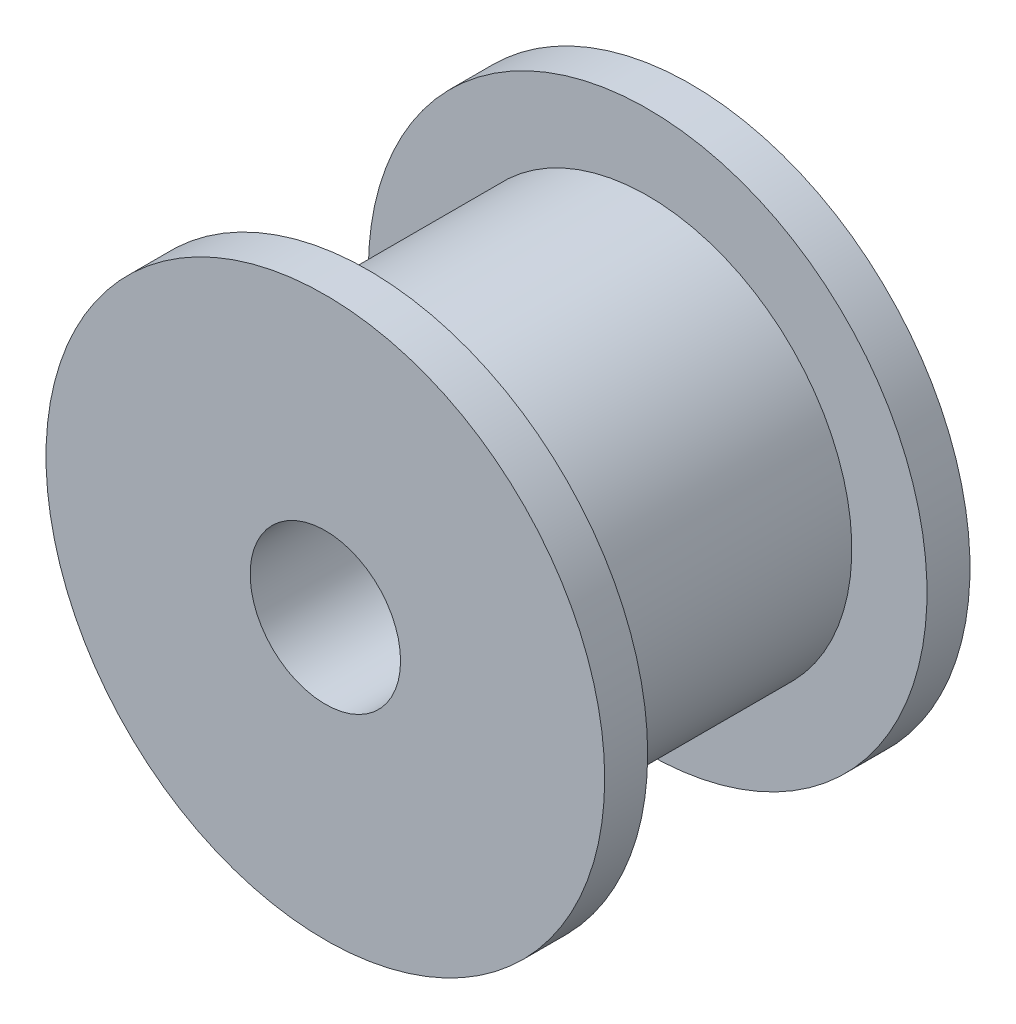
ISO-10303-21;
HEADER;
FILE_DESCRIPTION(('STEP AP214'),'2;1');
FILE_NAME('part.step','',(''),(''),'','','');
FILE_SCHEMA(('AUTOMOTIVE_DESIGN { 1 0 10303 214 1 1 1 1 }'));
ENDSEC;
DATA;
#1=APPLICATION_CONTEXT('core data for automotive mechanical design processes');
#2=APPLICATION_PROTOCOL_DEFINITION('international standard','automotive_design',2000,#1);
#3=PRODUCT_CONTEXT('',#1,'mechanical');
#4=PRODUCT('Part','Part','',(#3));
#5=PRODUCT_RELATED_PRODUCT_CATEGORY('part','',(#4));
#6=PRODUCT_DEFINITION_FORMATION('','',#4);
#7=PRODUCT_DEFINITION_CONTEXT('part definition',#1,'design');
#8=PRODUCT_DEFINITION('design','',#6,#7);
#9=PRODUCT_DEFINITION_SHAPE('','',#8);
#10=(LENGTH_UNIT() NAMED_UNIT(*) SI_UNIT(.MILLI.,.METRE.));
#11=(NAMED_UNIT(*) PLANE_ANGLE_UNIT() SI_UNIT($,.RADIAN.));
#12=(NAMED_UNIT(*) SI_UNIT($,.STERADIAN.) SOLID_ANGLE_UNIT());
#13=UNCERTAINTY_MEASURE_WITH_UNIT(LENGTH_MEASURE(1.E-05),#10,'distance_accuracy_value','');
#14=(GEOMETRIC_REPRESENTATION_CONTEXT(3) GLOBAL_UNCERTAINTY_ASSIGNED_CONTEXT((#13)) GLOBAL_UNIT_ASSIGNED_CONTEXT((#10,
#11,#12)) REPRESENTATION_CONTEXT('',''));
#15=CARTESIAN_POINT('',(0.,0.,0.));
#16=DIRECTION('',(0.,0.,1.));
#17=DIRECTION('',(1.,0.,0.));
#18=AXIS2_PLACEMENT_3D('',#15,#16,#17);
#19=CARTESIAN_POINT('',(0.,0.,6.5));
#20=DIRECTION('',(0.,0.,-1.));
#21=DIRECTION('',(-1.,0.,0.));
#22=AXIS2_PLACEMENT_3D('',#19,#20,#21);
#23=CYLINDRICAL_SURFACE('',#22,4.75);
#24=CARTESIAN_POINT('',(0.,0.,6.5));
#25=DIRECTION('',(0.,0.,1.));
#26=DIRECTION('',(1.,0.,0.));
#27=AXIS2_PLACEMENT_3D('',#24,#25,#26);
#28=CIRCLE('',#27,4.75);
#29=CARTESIAN_POINT('',(-4.75,0.,6.5));
#30=VERTEX_POINT('',#29);
#31=EDGE_CURVE('E10',#30,#30,#28,.T.);
#32=CARTESIAN_POINT('',(0.,0.,0.));
#33=DIRECTION('',(0.,0.,1.));
#34=DIRECTION('',(1.,0.,0.));
#35=AXIS2_PLACEMENT_3D('',#32,#33,#34);
#36=CIRCLE('',#35,4.75);
#37=CARTESIAN_POINT('',(-4.75,0.,0.));
#38=VERTEX_POINT('',#37);
#39=EDGE_CURVE('E47',#38,#38,#36,.T.);
#40=CARTESIAN_POINT('',(-4.75,0.,6.5));
#41=CARTESIAN_POINT('',(-4.75,0.,6.43229166666667));
#42=CARTESIAN_POINT('',(-4.75,0.,6.36458333333333));
#43=CARTESIAN_POINT('',(-4.75,0.,6.22916666666667));
#44=CARTESIAN_POINT('',(-4.75,0.,6.16145833333333));
#45=CARTESIAN_POINT('',(-4.75,0.,6.02604166666667));
#46=CARTESIAN_POINT('',(-4.75,0.,5.95833333333333));
#47=CARTESIAN_POINT('',(-4.75,0.,5.82291666666667));
#48=CARTESIAN_POINT('',(-4.75,0.,5.75520833333333));
#49=CARTESIAN_POINT('',(-4.75,0.,5.61979166666667));
#50=CARTESIAN_POINT('',(-4.75,0.,5.55208333333333));
#51=CARTESIAN_POINT('',(-4.75,0.,5.41666666666667));
#52=CARTESIAN_POINT('',(-4.75,0.,5.34895833333333));
#53=CARTESIAN_POINT('',(-4.75,0.,5.21354166666667));
#54=CARTESIAN_POINT('',(-4.75,0.,5.14583333333333));
#55=CARTESIAN_POINT('',(-4.75,0.,5.01041666666667));
#56=CARTESIAN_POINT('',(-4.75,0.,4.94270833333333));
#57=CARTESIAN_POINT('',(-4.75,0.,4.80729166666667));
#58=CARTESIAN_POINT('',(-4.75,0.,4.73958333333333));
#59=CARTESIAN_POINT('',(-4.75,0.,4.60416666666667));
#60=CARTESIAN_POINT('',(-4.75,0.,4.53645833333333));
#61=CARTESIAN_POINT('',(-4.75,0.,4.40104166666667));
#62=CARTESIAN_POINT('',(-4.75,0.,4.33333333333333));
#63=CARTESIAN_POINT('',(-4.75,0.,4.19791666666667));
#64=CARTESIAN_POINT('',(-4.75,0.,4.13020833333333));
#65=CARTESIAN_POINT('',(-4.75,0.,3.99479166666667));
#66=CARTESIAN_POINT('',(-4.75,0.,3.92708333333333));
#67=CARTESIAN_POINT('',(-4.75,0.,3.79166666666667));
#68=CARTESIAN_POINT('',(-4.75,0.,3.72395833333333));
#69=CARTESIAN_POINT('',(-4.75,0.,3.58854166666667));
#70=CARTESIAN_POINT('',(-4.75,0.,3.52083333333333));
#71=CARTESIAN_POINT('',(-4.75,0.,3.38541666666667));
#72=CARTESIAN_POINT('',(-4.75,0.,3.31770833333333));
#73=CARTESIAN_POINT('',(-4.75,0.,3.18229166666667));
#74=CARTESIAN_POINT('',(-4.75,0.,3.11458333333333));
#75=CARTESIAN_POINT('',(-4.75,0.,2.97916666666667));
#76=CARTESIAN_POINT('',(-4.75,0.,2.91145833333333));
#77=CARTESIAN_POINT('',(-4.75,0.,2.77604166666667));
#78=CARTESIAN_POINT('',(-4.75,0.,2.70833333333333));
#79=CARTESIAN_POINT('',(-4.75,0.,2.57291666666667));
#80=CARTESIAN_POINT('',(-4.75,0.,2.50520833333333));
#81=CARTESIAN_POINT('',(-4.75,0.,2.36979166666667));
#82=CARTESIAN_POINT('',(-4.75,0.,2.30208333333333));
#83=CARTESIAN_POINT('',(-4.75,0.,2.16666666666667));
#84=CARTESIAN_POINT('',(-4.75,0.,2.09895833333333));
#85=CARTESIAN_POINT('',(-4.75,0.,1.96354166666667));
#86=CARTESIAN_POINT('',(-4.75,0.,1.89583333333333));
#87=CARTESIAN_POINT('',(-4.75,0.,1.76041666666667));
#88=CARTESIAN_POINT('',(-4.75,0.,1.69270833333333));
#89=CARTESIAN_POINT('',(-4.75,0.,1.55729166666667));
#90=CARTESIAN_POINT('',(-4.75,0.,1.48958333333333));
#91=CARTESIAN_POINT('',(-4.75,0.,1.35416666666667));
#92=CARTESIAN_POINT('',(-4.75,0.,1.28645833333333));
#93=CARTESIAN_POINT('',(-4.75,0.,1.15104166666667));
#94=CARTESIAN_POINT('',(-4.75,0.,1.08333333333333));
#95=CARTESIAN_POINT('',(-4.75,0.,0.947916666666667));
#96=CARTESIAN_POINT('',(-4.75,0.,0.880208333333333));
#97=CARTESIAN_POINT('',(-4.75,0.,0.744791666666667));
#98=CARTESIAN_POINT('',(-4.75,0.,0.677083333333333));
#99=CARTESIAN_POINT('',(-4.75,0.,0.541666666666667));
#100=CARTESIAN_POINT('',(-4.75,0.,0.473958333333333));
#101=CARTESIAN_POINT('',(-4.75,0.,0.338541666666667));
#102=CARTESIAN_POINT('',(-4.75,0.,0.270833333333334));
#103=CARTESIAN_POINT('',(-4.75,0.,0.135416666666667));
#104=CARTESIAN_POINT('',(-4.75,0.,0.0677083333333334));
#105=CARTESIAN_POINT('',(-4.75,0.,0.));
#106=B_SPLINE_CURVE_WITH_KNOTS('',3,(#40,#41,#42,#43,#44,#45,#46,#47,#48,#49,#50,#51,#52,#53,
#54,#55,#56,#57,#58,#59,#60,#61,#62,#63,#64,#65,#66,#67,#68,#69,#70,#71,#72,#73,#74,#75,#76,#77,
#78,#79,#80,#81,#82,#83,#84,#85,#86,#87,#88,#89,#90,#91,#92,#93,#94,#95,#96,#97,#98,#99,#100,
#101,#102,#103,#104,#105),.UNSPECIFIED.,.F.,.F.,(4,2,2,2,2,2,2,2,2,2,2,2,2,2,2,2,2,2,2,2,2,2,2,
2,2,2,2,2,2,2,2,2,4),(0.,0.203125,0.40625,0.609375000000001,0.812500000000001,1.015625,1.21875,
1.421875,1.625,1.828125,2.03125,2.234375,2.4375,2.640625,2.84375,3.046875,3.25,3.453125,3.65625,
3.859375,4.0625,4.265625,4.46875,4.671875,4.875,5.078125,5.28125,5.484375,5.6875,5.890625,
6.09375,6.296875,6.5),.UNSPECIFIED.);
#107=EDGE_CURVE('BSEAM32',#30,#38,#106,.T.);
#108=ORIENTED_EDGE('',*,*,#31,.F.);
#109=ORIENTED_EDGE('',*,*,#39,.T.);
#110=ORIENTED_EDGE('',*,*,#107,.T.);
#111=ORIENTED_EDGE('',*,*,#107,.F.);
#112=EDGE_LOOP('',(#108,#110,#109,#111));
#113=FACE_BOUND('',#112,.T.);
#114=ADVANCED_FACE('F32',(#113),#23,.T.);
#115=CARTESIAN_POINT('',(0.,0.,7.5));
#116=DIRECTION('',(0.,0.,-1.));
#117=DIRECTION('',(-1.,0.,0.));
#118=AXIS2_PLACEMENT_3D('',#115,#116,#117);
#119=CYLINDRICAL_SURFACE('',#118,6.5);
#120=CARTESIAN_POINT('',(0.,0.,7.5));
#121=DIRECTION('',(0.,0.,1.));
#122=DIRECTION('',(1.,0.,0.));
#123=AXIS2_PLACEMENT_3D('',#120,#121,#122);
#124=CIRCLE('',#123,6.5);
#125=CARTESIAN_POINT('',(6.5,0.,7.5));
#126=VERTEX_POINT('',#125);
#127=EDGE_CURVE('E39',#126,#126,#124,.T.);
#128=ORIENTED_EDGE('',*,*,#127,.F.);
#129=EDGE_LOOP('',(#128));
#130=FACE_BOUND('',#129,.T.);
#131=CARTESIAN_POINT('',(0.,0.,6.5));
#132=DIRECTION('',(0.,0.,1.));
#133=DIRECTION('',(1.,0.,0.));
#134=AXIS2_PLACEMENT_3D('',#131,#132,#133);
#135=CIRCLE('',#134,6.5);
#136=CARTESIAN_POINT('',(6.5,0.,6.5));
#137=VERTEX_POINT('',#136);
#138=EDGE_CURVE('E44',#137,#137,#135,.T.);
#139=ORIENTED_EDGE('',*,*,#138,.T.);
#140=EDGE_LOOP('',(#139));
#141=FACE_BOUND('',#140,.T.);
#142=ADVANCED_FACE('F86',(#130,#141),#119,.T.);
#143=CARTESIAN_POINT('',(0.,0.,7.5));
#144=DIRECTION('',(0.,0.,1.));
#145=DIRECTION('',(1.,0.,0.));
#146=AXIS2_PLACEMENT_3D('',#143,#144,#145);
#147=PLANE('',#146);
#148=CARTESIAN_POINT('',(0.,0.,7.5));
#149=DIRECTION('',(0.,0.,1.));
#150=DIRECTION('',(1.,0.,0.));
#151=AXIS2_PLACEMENT_3D('',#148,#149,#150);
#152=CIRCLE('',#151,1.75);
#153=CARTESIAN_POINT('',(1.75,0.,7.5));
#154=VERTEX_POINT('',#153);
#155=EDGE_CURVE('E61',#154,#154,#152,.T.);
#156=ORIENTED_EDGE('',*,*,#155,.F.);
#157=EDGE_LOOP('',(#156));
#158=FACE_BOUND('',#157,.T.);
#159=ORIENTED_EDGE('',*,*,#127,.T.);
#160=EDGE_LOOP('',(#159));
#161=FACE_BOUND('',#160,.T.);
#162=ADVANCED_FACE('F91',(#158,#161),#147,.T.);
#163=CARTESIAN_POINT('',(0.,0.,6.5));
#164=DIRECTION('',(0.,0.,1.));
#165=DIRECTION('',(1.,0.,0.));
#166=AXIS2_PLACEMENT_3D('',#163,#164,#165);
#167=PLANE('',#166);
#168=ORIENTED_EDGE('',*,*,#31,.T.);
#169=EDGE_LOOP('',(#168));
#170=FACE_BOUND('',#169,.T.);
#171=ORIENTED_EDGE('',*,*,#138,.F.);
#172=EDGE_LOOP('',(#171));
#173=FACE_BOUND('',#172,.T.);
#174=ADVANCED_FACE('F81',(#170,#173),#167,.F.);
#175=CARTESIAN_POINT('',(0.,0.,-1.));
#176=DIRECTION('',(0.,0.,1.));
#177=DIRECTION('',(1.,0.,0.));
#178=AXIS2_PLACEMENT_3D('',#175,#176,#177);
#179=CYLINDRICAL_SURFACE('',#178,6.5);
#180=CARTESIAN_POINT('',(0.,0.,-1.));
#181=DIRECTION('',(0.,0.,-1.));
#182=DIRECTION('',(-1.,0.,0.));
#183=AXIS2_PLACEMENT_3D('',#180,#181,#182);
#184=CIRCLE('',#183,6.5);
#185=CARTESIAN_POINT('',(-6.5,0.,-1.));
#186=VERTEX_POINT('',#185);
#187=EDGE_CURVE('E49',#186,#186,#184,.T.);
#188=ORIENTED_EDGE('',*,*,#187,.F.);
#189=EDGE_LOOP('',(#188));
#190=FACE_BOUND('',#189,.T.);
#191=CARTESIAN_POINT('',(0.,0.,0.));
#192=DIRECTION('',(0.,0.,-1.));
#193=DIRECTION('',(-1.,0.,0.));
#194=AXIS2_PLACEMENT_3D('',#191,#192,#193);
#195=CIRCLE('',#194,6.5);
#196=CARTESIAN_POINT('',(-6.5,0.,0.));
#197=VERTEX_POINT('',#196);
#198=EDGE_CURVE('E54',#197,#197,#195,.T.);
#199=ORIENTED_EDGE('',*,*,#198,.T.);
#200=EDGE_LOOP('',(#199));
#201=FACE_BOUND('',#200,.T.);
#202=ADVANCED_FACE('F73',(#190,#201),#179,.T.);
#203=CARTESIAN_POINT('',(0.,0.,-1.));
#204=DIRECTION('',(0.,0.,-1.));
#205=DIRECTION('',(-1.,0.,0.));
#206=AXIS2_PLACEMENT_3D('',#203,#204,#205);
#207=PLANE('',#206);
#208=CARTESIAN_POINT('',(0.,0.,-1.));
#209=DIRECTION('',(0.,0.,-1.));
#210=DIRECTION('',(-1.,0.,0.));
#211=AXIS2_PLACEMENT_3D('',#208,#209,#210);
#212=CIRCLE('',#211,1.75);
#213=CARTESIAN_POINT('',(-1.75,0.,-1.));
#214=VERTEX_POINT('',#213);
#215=EDGE_CURVE('E35',#214,#214,#212,.T.);
#216=ORIENTED_EDGE('',*,*,#215,.F.);
#217=EDGE_LOOP('',(#216));
#218=FACE_BOUND('',#217,.T.);
#219=ORIENTED_EDGE('',*,*,#187,.T.);
#220=EDGE_LOOP('',(#219));
#221=FACE_BOUND('',#220,.T.);
#222=ADVANCED_FACE('F70',(#218,#221),#207,.T.);
#223=CARTESIAN_POINT('',(0.,0.,0.));
#224=DIRECTION('',(0.,0.,-1.));
#225=DIRECTION('',(-1.,0.,0.));
#226=AXIS2_PLACEMENT_3D('',#223,#224,#225);
#227=PLANE('',#226);
#228=ORIENTED_EDGE('',*,*,#39,.F.);
#229=EDGE_LOOP('',(#228));
#230=FACE_BOUND('',#229,.T.);
#231=ORIENTED_EDGE('',*,*,#198,.F.);
#232=EDGE_LOOP('',(#231));
#233=FACE_BOUND('',#232,.T.);
#234=ADVANCED_FACE('F72',(#230,#233),#227,.F.);
#235=CARTESIAN_POINT('',(0.,0.,-13.5));
#236=DIRECTION('',(0.,0.,1.));
#237=DIRECTION('',(1.,0.,0.));
#238=AXIS2_PLACEMENT_3D('',#235,#236,#237);
#239=CYLINDRICAL_SURFACE('',#238,1.75);
#240=ORIENTED_EDGE('',*,*,#215,.T.);
#241=EDGE_LOOP('',(#240));
#242=FACE_BOUND('',#241,.T.);
#243=ORIENTED_EDGE('',*,*,#155,.T.);
#244=EDGE_LOOP('',(#243));
#245=FACE_BOUND('',#244,.T.);
#246=ADVANCED_FACE('F68',(#242,#245),#239,.F.);
#247=CLOSED_SHELL('',(#114,#142,#162,#174,#202,#222,#234,#246));
#248=MANIFOLD_SOLID_BREP('B2',#247);
#249=ADVANCED_BREP_SHAPE_REPRESENTATION('',(#18,#248),#14);
#250=SHAPE_DEFINITION_REPRESENTATION(#9,#249);
ENDSEC;
END-ISO-10303-21;
